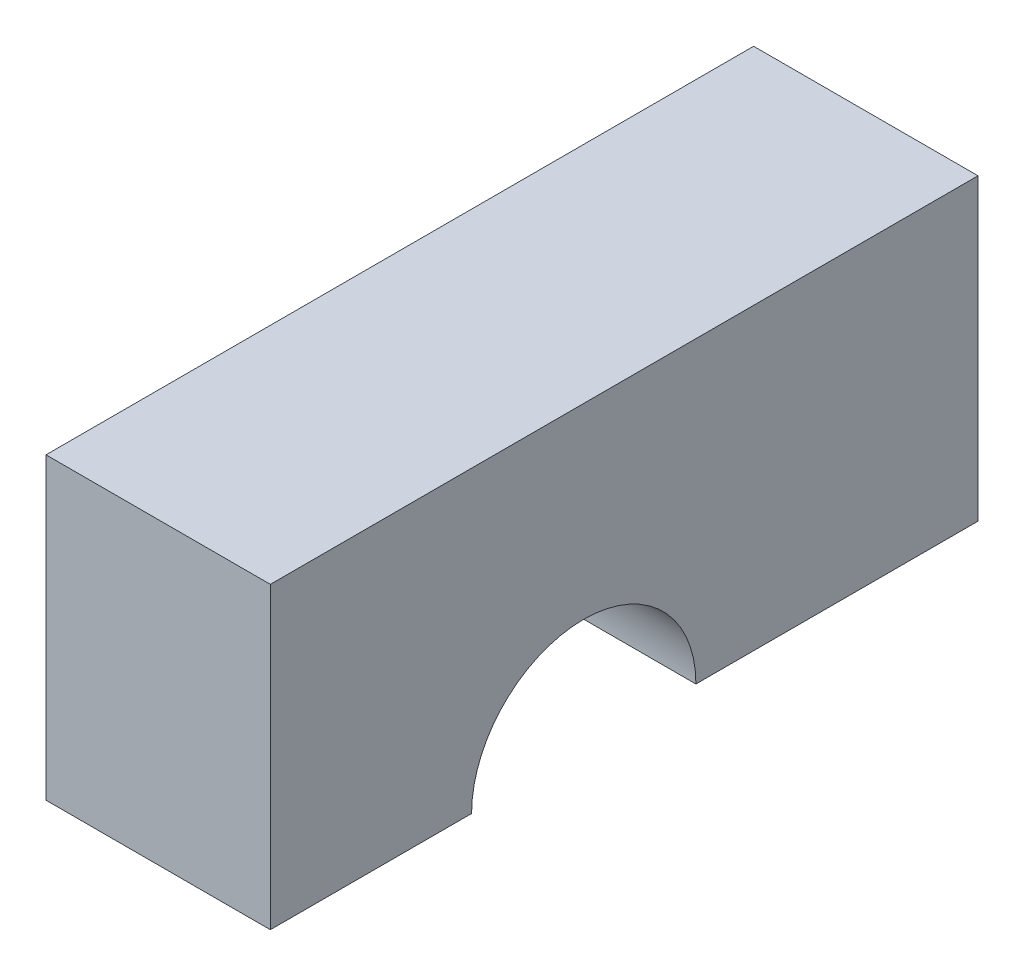
ISO-10303-21;
HEADER;
FILE_DESCRIPTION(('STEP AP214'),'2;1');
FILE_NAME('part.step','',(''),(''),'','','');
FILE_SCHEMA(('AUTOMOTIVE_DESIGN { 1 0 10303 214 1 1 1 1 }'));
ENDSEC;
DATA;
#1=APPLICATION_CONTEXT('core data for automotive mechanical design processes');
#2=APPLICATION_PROTOCOL_DEFINITION('international standard','automotive_design',2000,#1);
#3=PRODUCT_CONTEXT('',#1,'mechanical');
#4=PRODUCT('Part','Part','',(#3));
#5=PRODUCT_RELATED_PRODUCT_CATEGORY('part','',(#4));
#6=PRODUCT_DEFINITION_FORMATION('','',#4);
#7=PRODUCT_DEFINITION_CONTEXT('part definition',#1,'design');
#8=PRODUCT_DEFINITION('design','',#6,#7);
#9=PRODUCT_DEFINITION_SHAPE('','',#8);
#10=(LENGTH_UNIT() NAMED_UNIT(*) SI_UNIT(.MILLI.,.METRE.));
#11=(NAMED_UNIT(*) PLANE_ANGLE_UNIT() SI_UNIT($,.RADIAN.));
#12=(NAMED_UNIT(*) SI_UNIT($,.STERADIAN.) SOLID_ANGLE_UNIT());
#13=UNCERTAINTY_MEASURE_WITH_UNIT(LENGTH_MEASURE(1.E-05),#10,'distance_accuracy_value','');
#14=(GEOMETRIC_REPRESENTATION_CONTEXT(3) GLOBAL_UNCERTAINTY_ASSIGNED_CONTEXT((#13)) GLOBAL_UNIT_ASSIGNED_CONTEXT((#10,
#11,#12)) REPRESENTATION_CONTEXT('',''));
#15=CARTESIAN_POINT('',(0.,0.,0.));
#16=DIRECTION('',(0.,0.,1.));
#17=DIRECTION('',(1.,0.,0.));
#18=AXIS2_PLACEMENT_3D('',#15,#16,#17);
#19=CARTESIAN_POINT('',(0.,0.,0.));
#20=DIRECTION('',(0.,1.,0.));
#21=DIRECTION('',(0.,0.,1.));
#22=AXIS2_PLACEMENT_3D('',#19,#20,#21);
#23=PLANE('',#22);
#24=DIRECTION('',(0.,0.,1.));
#25=VECTOR('',#24,1.);
#26=CARTESIAN_POINT('',(-19.05,0.,42.5519066593606));
#27=LINE('',#26,#25);
#28=CARTESIAN_POINT('',(-19.05,0.,25.4653682428406));
#29=VERTEX_POINT('',#28);
#30=CARTESIAN_POINT('',(-19.05,0.,42.5519066593606));
#31=VERTEX_POINT('',#30);
#32=EDGE_CURVE('E116',#29,#31,#27,.T.);
#33=ORIENTED_EDGE('',*,*,#32,.F.);
#34=DIRECTION('',(1.,0.,0.));
#35=VECTOR('',#34,1.);
#36=CARTESIAN_POINT('',(-19.05,0.,25.4653682428406));
#37=LINE('',#36,#35);
#38=CARTESIAN_POINT('',(0.,0.,25.4653682428406));
#39=VERTEX_POINT('',#38);
#40=EDGE_CURVE('E11',#29,#39,#37,.T.);
#41=ORIENTED_EDGE('',*,*,#40,.T.);
#42=DIRECTION('',(0.,0.,-1.));
#43=VECTOR('',#42,1.);
#44=CARTESIAN_POINT('',(0.,0.,42.5519066593606));
#45=LINE('',#44,#43);
#46=CARTESIAN_POINT('',(0.,0.,42.5519066593606));
#47=VERTEX_POINT('',#46);
#48=EDGE_CURVE('E106',#47,#39,#45,.T.);
#49=ORIENTED_EDGE('',*,*,#48,.F.);
#50=DIRECTION('',(1.,0.,0.));
#51=VECTOR('',#50,1.);
#52=CARTESIAN_POINT('',(0.,0.,42.5519066593606));
#53=LINE('',#52,#51);
#54=EDGE_CURVE('E77',#31,#47,#53,.T.);
#55=ORIENTED_EDGE('',*,*,#54,.F.);
#56=EDGE_LOOP('',(#33,#41,#49,#55));
#57=FACE_BOUND('',#56,.T.);
#58=ADVANCED_FACE('F32',(#57),#23,.F.);
#59=CARTESIAN_POINT('',(0.,25.4,42.5519066593606));
#60=DIRECTION('',(-1.,0.,0.));
#61=DIRECTION('',(0.,0.,1.));
#62=AXIS2_PLACEMENT_3D('',#59,#60,#61);
#63=PLANE('',#62);
#64=ORIENTED_EDGE('',*,*,#48,.T.);
#65=CARTESIAN_POINT('',(0.,0.,15.9403682428406));
#66=DIRECTION('',(1.,0.,0.));
#67=DIRECTION('',(0.,0.,-1.));
#68=AXIS2_PLACEMENT_3D('',#65,#66,#67);
#69=CIRCLE('',#68,9.52500000000001);
#70=CARTESIAN_POINT('',(0.,0.,6.41536824284056));
#71=VERTEX_POINT('',#70);
#72=EDGE_CURVE('E94',#71,#39,#69,.T.);
#73=ORIENTED_EDGE('',*,*,#72,.F.);
#74=CARTESIAN_POINT('',(0.,0.,-17.5370559523405));
#75=VERTEX_POINT('',#74);
#76=EDGE_CURVE('E103',#71,#75,#45,.T.);
#77=ORIENTED_EDGE('',*,*,#76,.T.);
#78=DIRECTION('',(0.,-1.,0.));
#79=VECTOR('',#78,1.);
#80=CARTESIAN_POINT('',(0.,25.4,-17.5370559523405));
#81=LINE('',#80,#79);
#82=CARTESIAN_POINT('',(0.,25.4,-17.5370559523405));
#83=VERTEX_POINT('',#82);
#84=EDGE_CURVE('E99',#83,#75,#81,.T.);
#85=ORIENTED_EDGE('',*,*,#84,.F.);
#86=DIRECTION('',(0.,0.,-1.));
#87=VECTOR('',#86,1.);
#88=CARTESIAN_POINT('',(0.,25.4,42.5519066593606));
#89=LINE('',#88,#87);
#90=CARTESIAN_POINT('',(0.,25.4,42.5519066593606));
#91=VERTEX_POINT('',#90);
#92=EDGE_CURVE('E120',#91,#83,#89,.T.);
#93=ORIENTED_EDGE('',*,*,#92,.F.);
#94=DIRECTION('',(0.,-1.,0.));
#95=VECTOR('',#94,1.);
#96=CARTESIAN_POINT('',(0.,25.4,42.5519066593606));
#97=LINE('',#96,#95);
#98=EDGE_CURVE('E121',#91,#47,#97,.T.);
#99=ORIENTED_EDGE('',*,*,#98,.T.);
#100=EDGE_LOOP('',(#64,#73,#77,#85,#93,#99));
#101=FACE_BOUND('',#100,.T.);
#102=ADVANCED_FACE('F34',(#101),#63,.F.);
#103=CARTESIAN_POINT('',(0.,25.4,-17.5370559523405));
#104=DIRECTION('',(0.,0.,1.));
#105=DIRECTION('',(1.,0.,0.));
#106=AXIS2_PLACEMENT_3D('',#103,#104,#105);
#107=PLANE('',#106);
#108=DIRECTION('',(-1.,0.,0.));
#109=VECTOR('',#108,1.);
#110=CARTESIAN_POINT('',(0.,0.,-17.5370559523405));
#111=LINE('',#110,#109);
#112=CARTESIAN_POINT('',(-19.05,0.,-17.5370559523405));
#113=VERTEX_POINT('',#112);
#114=EDGE_CURVE('E109',#75,#113,#111,.T.);
#115=ORIENTED_EDGE('',*,*,#114,.T.);
#116=DIRECTION('',(0.,-1.,0.));
#117=VECTOR('',#116,1.);
#118=CARTESIAN_POINT('',(-19.05,25.4,-17.5370559523405));
#119=LINE('',#118,#117);
#120=CARTESIAN_POINT('',(-19.05,25.4,-17.5370559523405));
#121=VERTEX_POINT('',#120);
#122=EDGE_CURVE('E125',#121,#113,#119,.T.);
#123=ORIENTED_EDGE('',*,*,#122,.F.);
#124=DIRECTION('',(-1.,0.,0.));
#125=VECTOR('',#124,1.);
#126=CARTESIAN_POINT('',(0.,25.4,-17.5370559523405));
#127=LINE('',#126,#125);
#128=EDGE_CURVE('E85',#83,#121,#127,.T.);
#129=ORIENTED_EDGE('',*,*,#128,.F.);
#130=ORIENTED_EDGE('',*,*,#84,.T.);
#131=EDGE_LOOP('',(#115,#123,#129,#130));
#132=FACE_BOUND('',#131,.T.);
#133=ADVANCED_FACE('F128',(#132),#107,.F.);
#134=CARTESIAN_POINT('',(-19.05,25.4,42.5519066593606));
#135=DIRECTION('',(1.,0.,0.));
#136=DIRECTION('',(0.,0.,-1.));
#137=AXIS2_PLACEMENT_3D('',#134,#135,#136);
#138=PLANE('',#137);
#139=CARTESIAN_POINT('',(-19.05,0.,6.41536824284056));
#140=VERTEX_POINT('',#139);
#141=EDGE_CURVE('E117',#113,#140,#27,.T.);
#142=ORIENTED_EDGE('',*,*,#141,.T.);
#143=CARTESIAN_POINT('',(-19.05,0.,15.9403682428406));
#144=DIRECTION('',(1.,0.,0.));
#145=DIRECTION('',(0.,0.,-1.));
#146=AXIS2_PLACEMENT_3D('',#143,#144,#145);
#147=CIRCLE('',#146,9.52500000000001);
#148=EDGE_CURVE('E47',#140,#29,#147,.T.);
#149=ORIENTED_EDGE('',*,*,#148,.T.);
#150=ORIENTED_EDGE('',*,*,#32,.T.);
#151=DIRECTION('',(0.,-1.,0.));
#152=VECTOR('',#151,1.);
#153=CARTESIAN_POINT('',(-19.05,25.4,42.5519066593606));
#154=LINE('',#153,#152);
#155=CARTESIAN_POINT('',(-19.05,25.4,42.5519066593606));
#156=VERTEX_POINT('',#155);
#157=EDGE_CURVE('E123',#156,#31,#154,.T.);
#158=ORIENTED_EDGE('',*,*,#157,.F.);
#159=DIRECTION('',(0.,0.,1.));
#160=VECTOR('',#159,1.);
#161=CARTESIAN_POINT('',(-19.05,25.4,42.5519066593606));
#162=LINE('',#161,#160);
#163=EDGE_CURVE('E131',#121,#156,#162,.T.);
#164=ORIENTED_EDGE('',*,*,#163,.F.);
#165=ORIENTED_EDGE('',*,*,#122,.T.);
#166=EDGE_LOOP('',(#142,#149,#150,#158,#164,#165));
#167=FACE_BOUND('',#166,.T.);
#168=ADVANCED_FACE('F137',(#167),#138,.F.);
#169=CARTESIAN_POINT('',(0.,25.4,42.5519066593606));
#170=DIRECTION('',(0.,0.,-1.));
#171=DIRECTION('',(-1.,0.,0.));
#172=AXIS2_PLACEMENT_3D('',#169,#170,#171);
#173=PLANE('',#172);
#174=ORIENTED_EDGE('',*,*,#54,.T.);
#175=ORIENTED_EDGE('',*,*,#98,.F.);
#176=DIRECTION('',(1.,0.,0.));
#177=VECTOR('',#176,1.);
#178=CARTESIAN_POINT('',(0.,25.4,42.5519066593606));
#179=LINE('',#178,#177);
#180=EDGE_CURVE('E56',#156,#91,#179,.T.);
#181=ORIENTED_EDGE('',*,*,#180,.F.);
#182=ORIENTED_EDGE('',*,*,#157,.T.);
#183=EDGE_LOOP('',(#174,#175,#181,#182));
#184=FACE_BOUND('',#183,.T.);
#185=ADVANCED_FACE('F139',(#184),#173,.F.);
#186=CARTESIAN_POINT('',(0.,25.4,0.));
#187=DIRECTION('',(0.,1.,0.));
#188=DIRECTION('',(0.,0.,1.));
#189=AXIS2_PLACEMENT_3D('',#186,#187,#188);
#190=PLANE('',#189);
#191=ORIENTED_EDGE('',*,*,#92,.T.);
#192=ORIENTED_EDGE('',*,*,#128,.T.);
#193=ORIENTED_EDGE('',*,*,#163,.T.);
#194=ORIENTED_EDGE('',*,*,#180,.T.);
#195=EDGE_LOOP('',(#191,#192,#193,#194));
#196=FACE_BOUND('',#195,.T.);
#197=ADVANCED_FACE('F135',(#196),#190,.T.);
#198=ORIENTED_EDGE('',*,*,#76,.F.);
#199=DIRECTION('',(1.,0.,0.));
#200=VECTOR('',#199,1.);
#201=CARTESIAN_POINT('',(-19.05,0.,6.41536824284056));
#202=LINE('',#201,#200);
#203=EDGE_CURVE('E40',#71,#140,#202,.F.);
#204=ORIENTED_EDGE('',*,*,#203,.T.);
#205=ORIENTED_EDGE('',*,*,#141,.F.);
#206=ORIENTED_EDGE('',*,*,#114,.F.);
#207=EDGE_LOOP('',(#198,#204,#205,#206));
#208=FACE_BOUND('',#207,.T.);
#209=ADVANCED_FACE('F108',(#208),#23,.F.);
#210=CARTESIAN_POINT('',(-19.05,0.,15.9403682428406));
#211=DIRECTION('',(1.,0.,0.));
#212=DIRECTION('',(0.,0.,-1.));
#213=AXIS2_PLACEMENT_3D('',#210,#211,#212);
#214=CYLINDRICAL_SURFACE('',#213,9.52500000000001);
#215=ORIENTED_EDGE('',*,*,#148,.F.);
#216=ORIENTED_EDGE('',*,*,#203,.F.);
#217=ORIENTED_EDGE('',*,*,#72,.T.);
#218=ORIENTED_EDGE('',*,*,#40,.F.);
#219=EDGE_LOOP('',(#215,#216,#217,#218));
#220=FACE_BOUND('',#219,.T.);
#221=ADVANCED_FACE('F93',(#220),#214,.F.);
#222=CLOSED_SHELL('',(#58,#102,#133,#168,#185,#197,#209,#221));
#223=MANIFOLD_SOLID_BREP('B2',#222);
#224=ADVANCED_BREP_SHAPE_REPRESENTATION('',(#18,#223),#14);
#225=SHAPE_DEFINITION_REPRESENTATION(#9,#224);
ENDSEC;
END-ISO-10303-21;
